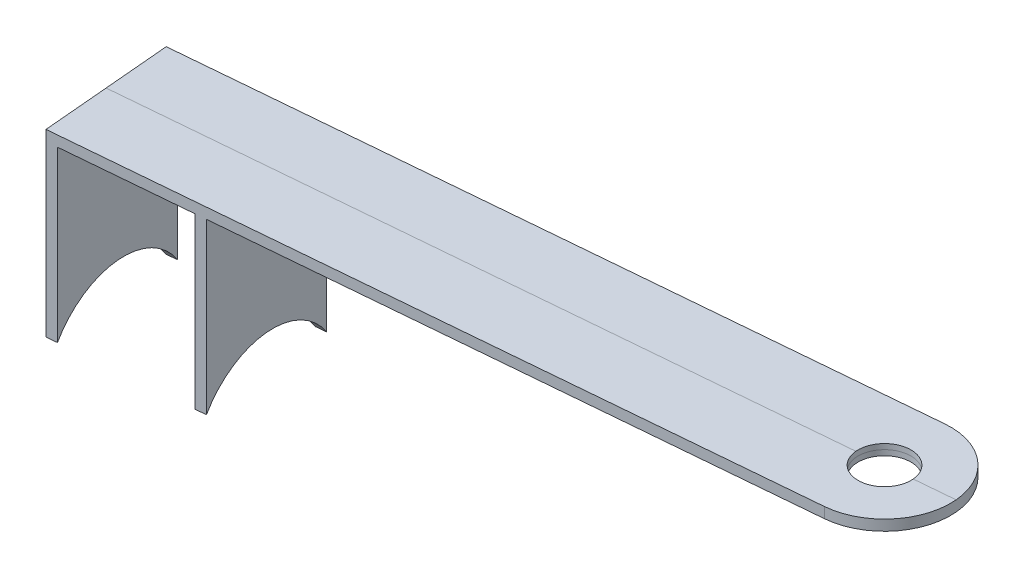
ISO-10303-21;
HEADER;
FILE_DESCRIPTION(('STEP AP214'),'2;1');
FILE_NAME('part.step','',(''),(''),'','','');
FILE_SCHEMA(('AUTOMOTIVE_DESIGN { 1 0 10303 214 1 1 1 1 }'));
ENDSEC;
DATA;
#1=APPLICATION_CONTEXT('core data for automotive mechanical design processes');
#2=APPLICATION_PROTOCOL_DEFINITION('international standard','automotive_design',2000,#1);
#3=PRODUCT_CONTEXT('',#1,'mechanical');
#4=PRODUCT('Part','Part','',(#3));
#5=PRODUCT_RELATED_PRODUCT_CATEGORY('part','',(#4));
#6=PRODUCT_DEFINITION_FORMATION('','',#4);
#7=PRODUCT_DEFINITION_CONTEXT('part definition',#1,'design');
#8=PRODUCT_DEFINITION('design','',#6,#7);
#9=PRODUCT_DEFINITION_SHAPE('','',#8);
#10=(LENGTH_UNIT() NAMED_UNIT(*) SI_UNIT(.MILLI.,.METRE.));
#11=(NAMED_UNIT(*) PLANE_ANGLE_UNIT() SI_UNIT($,.RADIAN.));
#12=(NAMED_UNIT(*) SI_UNIT($,.STERADIAN.) SOLID_ANGLE_UNIT());
#13=UNCERTAINTY_MEASURE_WITH_UNIT(LENGTH_MEASURE(1.E-05),#10,'distance_accuracy_value','');
#14=(GEOMETRIC_REPRESENTATION_CONTEXT(3) GLOBAL_UNCERTAINTY_ASSIGNED_CONTEXT((#13)) GLOBAL_UNIT_ASSIGNED_CONTEXT((#10,
#11,#12)) REPRESENTATION_CONTEXT('',''));
#15=CARTESIAN_POINT('',(0.,0.,0.));
#16=DIRECTION('',(0.,0.,1.));
#17=DIRECTION('',(1.,0.,0.));
#18=AXIS2_PLACEMENT_3D('',#15,#16,#17);
#19=CARTESIAN_POINT('',(95.5283362919159,42.2871579513113,-67.7014814945898));
#20=DIRECTION('',(0.,-1.,0.));
#21=DIRECTION('',(0.,0.,-1.));
#22=AXIS2_PLACEMENT_3D('',#19,#20,#21);
#23=CYLINDRICAL_SURFACE('',#22,5.00000000000001);
#24=CARTESIAN_POINT('',(95.5283362919159,40.2871579513113,-67.7014814945898));
#25=DIRECTION('',(0.,1.,0.));
#26=DIRECTION('',(0.,0.,1.));
#27=AXIS2_PLACEMENT_3D('',#24,#25,#26);
#28=CIRCLE('',#27,5.00000000000001);
#29=CARTESIAN_POINT('',(95.5283362919159,40.2871579513113,-62.7014814945897));
#30=VERTEX_POINT('',#29);
#31=EDGE_CURVE('E169',#30,#30,#28,.T.);
#32=ORIENTED_EDGE('',*,*,#31,.F.);
#33=EDGE_LOOP('',(#32));
#34=FACE_BOUND('',#33,.T.);
#35=CARTESIAN_POINT('',(95.5283362919159,41.2871579513113,-67.7014814945898));
#36=DIRECTION('',(0.,1.,0.));
#37=DIRECTION('',(0.,0.,1.));
#38=AXIS2_PLACEMENT_3D('',#35,#36,#37);
#39=CIRCLE('',#38,5.00000000000001);
#40=CARTESIAN_POINT('',(95.5283362919159,41.2871579513113,-62.7014814945897));
#41=VERTEX_POINT('',#40);
#42=EDGE_CURVE('E12',#41,#41,#39,.T.);
#43=ORIENTED_EDGE('',*,*,#42,.T.);
#44=EDGE_LOOP('',(#43));
#45=FACE_BOUND('',#44,.T.);
#46=ADVANCED_FACE('F48',(#34,#45),#23,.F.);
#47=CARTESIAN_POINT('',(95.5283362919159,42.2871579513113,-67.7014814945898));
#48=DIRECTION('',(0.,1.,0.));
#49=DIRECTION('',(0.,0.,1.));
#50=AXIS2_PLACEMENT_3D('',#47,#48,#49);
#51=PLANE('',#50);
#52=CARTESIAN_POINT('',(95.5283362919159,42.2871579513113,-67.7014814945898));
#53=DIRECTION('',(0.,1.,0.));
#54=DIRECTION('',(0.,0.,1.));
#55=AXIS2_PLACEMENT_3D('',#52,#53,#54);
#56=CIRCLE('',#55,12.5);
#57=CARTESIAN_POINT('',(96.6177830762615,42.2871579513113,-55.2490477684429));
#58=VERTEX_POINT('',#57);
#59=CARTESIAN_POINT('',(107.980770018063,42.2871579513113,-68.7909282789354));
#60=VERTEX_POINT('',#59);
#61=EDGE_CURVE('E174',#58,#60,#56,.T.);
#62=ORIENTED_EDGE('',*,*,#61,.T.);
#63=DIRECTION('',(-0.996194698091746,0.,0.0871557427476519));
#64=VECTOR('',#63,1.);
#65=CARTESIAN_POINT('',(95.5283362919159,42.2871579513113,-67.7014814945897));
#66=LINE('',#65,#64);
#67=CARTESIAN_POINT('',(100.509309782375,42.2871579513113,-68.137260208328));
#68=VERTEX_POINT('',#67);
#69=EDGE_CURVE('E58',#60,#68,#66,.T.);
#70=ORIENTED_EDGE('',*,*,#69,.T.);
#71=CARTESIAN_POINT('',(95.5283362919159,42.2871579513113,-67.7014814945898));
#72=DIRECTION('',(0.,1.,0.));
#73=DIRECTION('',(0.,0.,1.));
#74=AXIS2_PLACEMENT_3D('',#71,#72,#73);
#75=CIRCLE('',#74,5.00000000000001);
#76=CARTESIAN_POINT('',(90.5473628014572,42.2871579513113,-67.2657027808515));
#77=VERTEX_POINT('',#76);
#78=EDGE_CURVE('E269',#77,#68,#75,.T.);
#79=ORIENTED_EDGE('',*,*,#78,.F.);
#80=CARTESIAN_POINT('',(-39.7908169974657,42.2871579513113,-55.862589623843));
#81=VERTEX_POINT('',#80);
#82=EDGE_CURVE('E65',#77,#81,#66,.T.);
#83=ORIENTED_EDGE('',*,*,#82,.T.);
#84=DIRECTION('',(0.0871557427476516,0.,0.996194698091746));
#85=VECTOR('',#84,1.);
#86=CARTESIAN_POINT('',(-40.8802637818113,42.2871579513113,-68.3150233499898));
#87=LINE('',#86,#85);
#88=CARTESIAN_POINT('',(-38.70137021312,42.2871579513113,-43.4101558976961));
#89=VERTEX_POINT('',#88);
#90=EDGE_CURVE('E157',#81,#89,#87,.T.);
#91=ORIENTED_EDGE('',*,*,#90,.T.);
#92=DIRECTION('',(0.996194698091746,0.,-0.0871557427476518));
#93=VECTOR('',#92,1.);
#94=CARTESIAN_POINT('',(-38.70137021312,42.2871579513113,-43.4101558976961));
#95=LINE('',#94,#93);
#96=EDGE_CURVE('E158',#89,#58,#95,.T.);
#97=ORIENTED_EDGE('',*,*,#96,.T.);
#98=EDGE_LOOP('',(#62,#70,#79,#83,#91,#97));
#99=FACE_BOUND('',#98,.T.);
#100=ADVANCED_FACE('F250',(#99),#51,.T.);
#101=CARTESIAN_POINT('',(-37.7984276012822,0.,-56.0369011093383));
#102=DIRECTION('',(-0.996194698091746,0.,0.0871557427476517));
#103=DIRECTION('',(0.0871557427476517,0.,0.996194698091746));
#104=AXIS2_PLACEMENT_3D('',#101,#102,#103);
#105=CYLINDRICAL_SURFACE('',#104,15.);
#106=CARTESIAN_POINT('',(-39.7908169974657,0.,-55.862589623843));
#107=DIRECTION('',(0.996194698091746,0.,-0.0871557427476517));
#108=DIRECTION('',(-0.0871557427476517,0.,-0.996194698091746));
#109=AXIS2_PLACEMENT_3D('',#106,#107,#108);
#110=CIRCLE('',#109,15.);
#111=CARTESIAN_POINT('',(-40.8802637818113,8.2915619758885,-68.3150233499898));
#112=VERTEX_POINT('',#111);
#113=CARTESIAN_POINT('',(-38.70137021312,8.2915619758885,-43.4101558976961));
#114=VERTEX_POINT('',#113);
#115=EDGE_CURVE('E219',#112,#114,#110,.T.);
#116=ORIENTED_EDGE('',*,*,#115,.F.);
#117=DIRECTION('',(-0.996194698091746,0.,0.0871557427476517));
#118=VECTOR('',#117,1.);
#119=CARTESIAN_POINT('',(-38.8878743856278,8.2915619758885,-68.4893348354851));
#120=LINE('',#119,#118);
#121=CARTESIAN_POINT('',(-38.8878743856278,8.2915619758885,-68.4893348354851));
#122=VERTEX_POINT('',#121);
#123=EDGE_CURVE('E146',#122,#112,#120,.T.);
#124=ORIENTED_EDGE('',*,*,#123,.F.);
#125=CARTESIAN_POINT('',(-37.7984276012822,0.,-56.0369011093383));
#126=DIRECTION('',(0.996194698091746,0.,-0.0871557427476517));
#127=DIRECTION('',(-0.0871557427476517,0.,-0.996194698091746));
#128=AXIS2_PLACEMENT_3D('',#125,#126,#127);
#129=CIRCLE('',#128,15.);
#130=CARTESIAN_POINT('',(-36.7089808169365,8.2915619758885,-43.5844673831914));
#131=VERTEX_POINT('',#130);
#132=EDGE_CURVE('E150',#122,#131,#129,.T.);
#133=ORIENTED_EDGE('',*,*,#132,.T.);
#134=DIRECTION('',(-0.996194698091746,0.,0.0871557427476517));
#135=VECTOR('',#134,1.);
#136=CARTESIAN_POINT('',(-36.7089808169365,8.2915619758885,-43.5844673831914));
#137=LINE('',#136,#135);
#138=EDGE_CURVE('E256',#131,#114,#137,.T.);
#139=ORIENTED_EDGE('',*,*,#138,.T.);
#140=EDGE_LOOP('',(#116,#124,#133,#139));
#141=FACE_BOUND('',#140,.T.);
#142=ADVANCED_FACE('F50',(#141),#105,.F.);
#143=CARTESIAN_POINT('',(-38.8878743856278,8.2915619758885,-68.4893348354851));
#144=DIRECTION('',(-0.0871557427476517,0.,-0.996194698091746));
#145=DIRECTION('',(-0.996194698091746,0.,0.0871557427476517));
#146=AXIS2_PLACEMENT_3D('',#143,#144,#145);
#147=PLANE('',#146);
#148=DIRECTION('',(0.,-1.,0.));
#149=VECTOR('',#148,1.);
#150=CARTESIAN_POINT('',(-40.8802637818113,8.2915619758885,-68.3150233499898));
#151=LINE('',#150,#149);
#152=CARTESIAN_POINT('',(-40.8802637818113,42.2871579513113,-68.3150233499898));
#153=VERTEX_POINT('',#152);
#154=EDGE_CURVE('E139',#153,#112,#151,.T.);
#155=ORIENTED_EDGE('',*,*,#154,.F.);
#156=DIRECTION('',(-0.996194698091746,0.,0.0871557427476517));
#157=VECTOR('',#156,1.);
#158=CARTESIAN_POINT('',(-40.8802637818113,42.2871579513113,-68.3150233499898));
#159=LINE('',#158,#157);
#160=CARTESIAN_POINT('',(94.4388895075703,42.2871579513113,-80.1539152207366));
#161=VERTEX_POINT('',#160);
#162=EDGE_CURVE('E144',#161,#153,#159,.T.);
#163=ORIENTED_EDGE('',*,*,#162,.F.);
#164=DIRECTION('',(0.,-1.,0.));
#165=VECTOR('',#164,1.);
#166=CARTESIAN_POINT('',(94.4388895075703,42.2871579513113,-80.1539152207366));
#167=LINE('',#166,#165);
#168=CARTESIAN_POINT('',(94.4388895075703,40.2871579513113,-80.1539152207366));
#169=VERTEX_POINT('',#168);
#170=EDGE_CURVE('E176',#161,#169,#167,.T.);
#171=ORIENTED_EDGE('',*,*,#170,.T.);
#172=DIRECTION('',(-0.996194698091746,0.,0.0871557427476517));
#173=VECTOR('',#172,1.);
#174=CARTESIAN_POINT('',(-40.8802637818113,40.2871579513113,-68.3150233499898));
#175=LINE('',#174,#173);
#176=CARTESIAN_POINT('',(-12.9868122352424,40.2871579513113,-70.755384146924));
#177=VERTEX_POINT('',#176);
#178=EDGE_CURVE('E177',#169,#177,#175,.T.);
#179=ORIENTED_EDGE('',*,*,#178,.T.);
#180=DIRECTION('',(0.,-1.,0.));
#181=VECTOR('',#180,1.);
#182=CARTESIAN_POINT('',(-12.9868122352424,8.2915619758885,-70.755384146924));
#183=LINE('',#182,#181);
#184=CARTESIAN_POINT('',(-12.9868122352424,8.2915619758885,-70.755384146924));
#185=VERTEX_POINT('',#184);
#186=EDGE_CURVE('E192',#177,#185,#183,.T.);
#187=ORIENTED_EDGE('',*,*,#186,.T.);
#188=DIRECTION('',(0.996194698091746,0.,-0.0871557427476517));
#189=VECTOR('',#188,1.);
#190=CARTESIAN_POINT('',(-14.9792016314259,8.2915619758885,-70.5810726614287));
#191=LINE('',#190,#189);
#192=CARTESIAN_POINT('',(-14.9792016314259,8.2915619758885,-70.5810726614287));
#193=VERTEX_POINT('',#192);
#194=EDGE_CURVE('E216',#193,#185,#191,.T.);
#195=ORIENTED_EDGE('',*,*,#194,.F.);
#196=DIRECTION('',(0.,-1.,0.));
#197=VECTOR('',#196,1.);
#198=CARTESIAN_POINT('',(-14.9792016314259,8.2915619758885,-70.5810726614287));
#199=LINE('',#198,#197);
#200=CARTESIAN_POINT('',(-14.9792016314259,40.2871579513113,-70.5810726614287));
#201=VERTEX_POINT('',#200);
#202=EDGE_CURVE('E199',#201,#193,#199,.T.);
#203=ORIENTED_EDGE('',*,*,#202,.F.);
#204=CARTESIAN_POINT('',(-38.8878743856278,40.2871579513113,-68.4893348354851));
#205=VERTEX_POINT('',#204);
#206=EDGE_CURVE('E181',#201,#205,#175,.T.);
#207=ORIENTED_EDGE('',*,*,#206,.T.);
#208=DIRECTION('',(0.,-1.,0.));
#209=VECTOR('',#208,1.);
#210=CARTESIAN_POINT('',(-38.8878743856278,8.2915619758885,-68.4893348354851));
#211=LINE('',#210,#209);
#212=EDGE_CURVE('E257',#205,#122,#211,.T.);
#213=ORIENTED_EDGE('',*,*,#212,.T.);
#214=ORIENTED_EDGE('',*,*,#123,.T.);
#215=EDGE_LOOP('',(#155,#163,#171,#179,#187,#195,#203,#207,#213,#214));
#216=FACE_BOUND('',#215,.T.);
#217=ADVANCED_FACE('F141',(#216),#147,.T.);
#218=CARTESIAN_POINT('',(-36.7089808169365,40.2871579513113,-43.5844673831914));
#219=DIRECTION('',(0.0871557427476517,0.,0.996194698091746));
#220=DIRECTION('',(0.996194698091746,0.,-0.0871557427476517));
#221=AXIS2_PLACEMENT_3D('',#218,#219,#220);
#222=PLANE('',#221);
#223=DIRECTION('',(0.,1.,0.));
#224=VECTOR('',#223,1.);
#225=CARTESIAN_POINT('',(-38.70137021312,40.2871579513113,-43.4101558976961));
#226=LINE('',#225,#224);
#227=EDGE_CURVE('E151',#114,#89,#226,.T.);
#228=ORIENTED_EDGE('',*,*,#227,.F.);
#229=ORIENTED_EDGE('',*,*,#138,.F.);
#230=DIRECTION('',(0.,1.,0.));
#231=VECTOR('',#230,1.);
#232=CARTESIAN_POINT('',(-36.7089808169365,40.2871579513113,-43.5844673831914));
#233=LINE('',#232,#231);
#234=CARTESIAN_POINT('',(-36.7089808169365,40.2871579513113,-43.5844673831914));
#235=VERTEX_POINT('',#234);
#236=EDGE_CURVE('E226',#131,#235,#233,.T.);
#237=ORIENTED_EDGE('',*,*,#236,.T.);
#238=DIRECTION('',(0.996194698091746,0.,-0.0871557427476518));
#239=VECTOR('',#238,1.);
#240=CARTESIAN_POINT('',(-38.70137021312,40.2871579513113,-43.4101558976961));
#241=LINE('',#240,#239);
#242=CARTESIAN_POINT('',(-12.8003080627346,40.2871579513113,-45.6762052091351));
#243=VERTEX_POINT('',#242);
#244=EDGE_CURVE('E166',#235,#243,#241,.T.);
#245=ORIENTED_EDGE('',*,*,#244,.T.);
#246=DIRECTION('',(0.,1.,0.));
#247=VECTOR('',#246,1.);
#248=CARTESIAN_POINT('',(-12.8003080627346,40.2871579513113,-45.6762052091351));
#249=LINE('',#248,#247);
#250=CARTESIAN_POINT('',(-12.8003080627346,8.2915619758885,-45.6762052091351));
#251=VERTEX_POINT('',#250);
#252=EDGE_CURVE('E191',#251,#243,#249,.T.);
#253=ORIENTED_EDGE('',*,*,#252,.F.);
#254=DIRECTION('',(0.996194698091746,0.,-0.0871557427476517));
#255=VECTOR('',#254,1.);
#256=CARTESIAN_POINT('',(-12.8003080627346,8.2915619758885,-45.6762052091351));
#257=LINE('',#256,#255);
#258=CARTESIAN_POINT('',(-10.8079186665511,8.2915619758885,-45.8505166946304));
#259=VERTEX_POINT('',#258);
#260=EDGE_CURVE('E220',#251,#259,#257,.T.);
#261=ORIENTED_EDGE('',*,*,#260,.T.);
#262=DIRECTION('',(0.,1.,0.));
#263=VECTOR('',#262,1.);
#264=CARTESIAN_POINT('',(-10.8079186665511,40.2871579513113,-45.8505166946304));
#265=LINE('',#264,#263);
#266=CARTESIAN_POINT('',(-10.8079186665511,40.2871579513113,-45.8505166946304));
#267=VERTEX_POINT('',#266);
#268=EDGE_CURVE('E214',#259,#267,#265,.T.);
#269=ORIENTED_EDGE('',*,*,#268,.T.);
#270=CARTESIAN_POINT('',(96.6177830762615,40.2871579513113,-55.2490477684429));
#271=VERTEX_POINT('',#270);
#272=EDGE_CURVE('E180',#267,#271,#241,.T.);
#273=ORIENTED_EDGE('',*,*,#272,.T.);
#274=DIRECTION('',(0.,-1.,0.));
#275=VECTOR('',#274,1.);
#276=CARTESIAN_POINT('',(96.6177830762615,42.2871579513113,-55.2490477684429));
#277=LINE('',#276,#275);
#278=EDGE_CURVE('E184',#58,#271,#277,.T.);
#279=ORIENTED_EDGE('',*,*,#278,.F.);
#280=ORIENTED_EDGE('',*,*,#96,.F.);
#281=EDGE_LOOP('',(#228,#229,#237,#245,#253,#261,#269,#273,#279,#280));
#282=FACE_BOUND('',#281,.T.);
#283=ADVANCED_FACE('F236',(#282),#222,.T.);
#284=CARTESIAN_POINT('',(-37.7984276012822,0.,-56.0369011093383));
#285=DIRECTION('',(0.996194698091746,0.,-0.0871557427476517));
#286=DIRECTION('',(-0.0871557427476517,0.,-0.996194698091746));
#287=AXIS2_PLACEMENT_3D('',#284,#285,#286);
#288=PLANE('',#287);
#289=ORIENTED_EDGE('',*,*,#132,.F.);
#290=ORIENTED_EDGE('',*,*,#212,.F.);
#291=DIRECTION('',(-0.0871557427476516,0.,-0.996194698091746));
#292=VECTOR('',#291,1.);
#293=CARTESIAN_POINT('',(-38.8878743856278,40.2871579513113,-68.4893348354851));
#294=LINE('',#293,#292);
#295=EDGE_CURVE('E418',#235,#205,#294,.T.);
#296=ORIENTED_EDGE('',*,*,#295,.F.);
#297=ORIENTED_EDGE('',*,*,#236,.F.);
#298=EDGE_LOOP('',(#289,#290,#296,#297));
#299=FACE_BOUND('',#298,.T.);
#300=ADVANCED_FACE('F304',(#299),#288,.T.);
#301=CARTESIAN_POINT('',(-39.7908169974657,0.,-55.862589623843));
#302=DIRECTION('',(0.996194698091746,0.,-0.0871557427476517));
#303=DIRECTION('',(-0.0871557427476517,0.,-0.996194698091746));
#304=AXIS2_PLACEMENT_3D('',#301,#302,#303);
#305=PLANE('',#304);
#306=ORIENTED_EDGE('',*,*,#115,.T.);
#307=ORIENTED_EDGE('',*,*,#227,.T.);
#308=ORIENTED_EDGE('',*,*,#90,.F.);
#309=EDGE_CURVE('E154',#153,#81,#87,.T.);
#310=ORIENTED_EDGE('',*,*,#309,.F.);
#311=ORIENTED_EDGE('',*,*,#154,.T.);
#312=EDGE_LOOP('',(#306,#307,#308,#310,#311));
#313=FACE_BOUND('',#312,.T.);
#314=ADVANCED_FACE('F155',(#313),#305,.F.);
#315=CARTESIAN_POINT('',(95.5283362919159,40.2871579513113,-67.7014814945898));
#316=DIRECTION('',(0.,1.,0.));
#317=DIRECTION('',(0.,0.,1.));
#318=AXIS2_PLACEMENT_3D('',#315,#316,#317);
#319=PLANE('',#318);
#320=ORIENTED_EDGE('',*,*,#244,.F.);
#321=ORIENTED_EDGE('',*,*,#295,.T.);
#322=ORIENTED_EDGE('',*,*,#206,.F.);
#323=DIRECTION('',(-0.0871557427476519,0.,-0.996194698091746));
#324=VECTOR('',#323,1.);
#325=CARTESIAN_POINT('',(-14.9792016314259,40.2871579513113,-70.5810726614287));
#326=LINE('',#325,#324);
#327=EDGE_CURVE('E195',#243,#201,#326,.T.);
#328=ORIENTED_EDGE('',*,*,#327,.F.);
#329=EDGE_LOOP('',(#320,#321,#322,#328));
#330=FACE_BOUND('',#329,.T.);
#331=ADVANCED_FACE('F291',(#330),#319,.F.);
#332=CARTESIAN_POINT('',(-13.8897548470803,0.,-58.1286389352819));
#333=DIRECTION('',(0.996194698091746,0.,-0.0871557427476517));
#334=DIRECTION('',(0.0871557427476518,0.,0.996194698091746));
#335=AXIS2_PLACEMENT_3D('',#332,#333,#334);
#336=CYLINDRICAL_SURFACE('',#335,15.);
#337=CARTESIAN_POINT('',(-11.8973654508968,0.,-58.3029504207772));
#338=DIRECTION('',(0.996194698091746,0.,-0.0871557427476517));
#339=DIRECTION('',(-0.0871557427476518,0.,-0.996194698091746));
#340=AXIS2_PLACEMENT_3D('',#337,#338,#339);
#341=CIRCLE('',#340,15.);
#342=EDGE_CURVE('E186',#185,#259,#341,.T.);
#343=ORIENTED_EDGE('',*,*,#342,.T.);
#344=ORIENTED_EDGE('',*,*,#260,.F.);
#345=CARTESIAN_POINT('',(-13.8897548470803,0.,-58.1286389352819));
#346=DIRECTION('',(0.996194698091746,0.,-0.0871557427476517));
#347=DIRECTION('',(-0.0871557427476518,0.,-0.996194698091746));
#348=AXIS2_PLACEMENT_3D('',#345,#346,#347);
#349=CIRCLE('',#348,15.);
#350=EDGE_CURVE('E187',#193,#251,#349,.T.);
#351=ORIENTED_EDGE('',*,*,#350,.F.);
#352=ORIENTED_EDGE('',*,*,#194,.T.);
#353=EDGE_LOOP('',(#343,#344,#351,#352));
#354=FACE_BOUND('',#353,.T.);
#355=ADVANCED_FACE('F293',(#354),#336,.F.);
#356=CARTESIAN_POINT('',(-13.8897548470803,0.,-58.1286389352819));
#357=DIRECTION('',(-0.996194698091746,0.,0.0871557427476517));
#358=DIRECTION('',(-0.0871557427476518,0.,-0.996194698091746));
#359=AXIS2_PLACEMENT_3D('',#356,#357,#358);
#360=PLANE('',#359);
#361=ORIENTED_EDGE('',*,*,#350,.T.);
#362=ORIENTED_EDGE('',*,*,#252,.T.);
#363=ORIENTED_EDGE('',*,*,#327,.T.);
#364=ORIENTED_EDGE('',*,*,#202,.T.);
#365=EDGE_LOOP('',(#361,#362,#363,#364));
#366=FACE_BOUND('',#365,.T.);
#367=ADVANCED_FACE('F296',(#366),#360,.T.);
#368=CARTESIAN_POINT('',(-11.8973654508968,0.,-58.3029504207772));
#369=DIRECTION('',(-0.996194698091746,0.,0.0871557427476517));
#370=DIRECTION('',(-0.0871557427476518,0.,-0.996194698091746));
#371=AXIS2_PLACEMENT_3D('',#368,#369,#370);
#372=PLANE('',#371);
#373=ORIENTED_EDGE('',*,*,#342,.F.);
#374=ORIENTED_EDGE('',*,*,#186,.F.);
#375=DIRECTION('',(-0.0871557427476519,0.,-0.996194698091746));
#376=VECTOR('',#375,1.);
#377=CARTESIAN_POINT('',(-12.9868122352424,40.2871579513113,-70.755384146924));
#378=LINE('',#377,#376);
#379=EDGE_CURVE('E210',#267,#177,#378,.T.);
#380=ORIENTED_EDGE('',*,*,#379,.F.);
#381=ORIENTED_EDGE('',*,*,#268,.F.);
#382=EDGE_LOOP('',(#373,#374,#380,#381));
#383=FACE_BOUND('',#382,.T.);
#384=ADVANCED_FACE('F240',(#383),#372,.F.);
#385=ORIENTED_EDGE('',*,*,#31,.T.);
#386=EDGE_LOOP('',(#385));
#387=FACE_BOUND('',#386,.T.);
#388=ORIENTED_EDGE('',*,*,#272,.F.);
#389=ORIENTED_EDGE('',*,*,#379,.T.);
#390=ORIENTED_EDGE('',*,*,#178,.F.);
#391=CARTESIAN_POINT('',(95.5283362919159,40.2871579513113,-67.7014814945898));
#392=DIRECTION('',(0.,1.,0.));
#393=DIRECTION('',(0.,0.,1.));
#394=AXIS2_PLACEMENT_3D('',#391,#392,#393);
#395=CIRCLE('',#394,12.5);
#396=EDGE_CURVE('E164',#271,#169,#395,.T.);
#397=ORIENTED_EDGE('',*,*,#396,.F.);
#398=EDGE_LOOP('',(#388,#389,#390,#397));
#399=FACE_BOUND('',#398,.T.);
#400=ADVANCED_FACE('F243',(#387,#399),#319,.F.);
#401=ORIENTED_EDGE('',*,*,#69,.F.);
#402=EDGE_CURVE('E162',#60,#161,#56,.T.);
#403=ORIENTED_EDGE('',*,*,#402,.T.);
#404=ORIENTED_EDGE('',*,*,#162,.T.);
#405=ORIENTED_EDGE('',*,*,#309,.T.);
#406=ORIENTED_EDGE('',*,*,#82,.F.);
#407=EDGE_CURVE('E266',#68,#77,#75,.T.);
#408=ORIENTED_EDGE('',*,*,#407,.F.);
#409=EDGE_LOOP('',(#401,#403,#404,#405,#406,#408));
#410=FACE_BOUND('',#409,.T.);
#411=ADVANCED_FACE('F160',(#410),#51,.T.);
#412=CARTESIAN_POINT('',(95.5283362919159,42.2871579513113,-67.7014814945898));
#413=DIRECTION('',(0.,-1.,0.));
#414=DIRECTION('',(0.,0.,-1.));
#415=AXIS2_PLACEMENT_3D('',#412,#413,#414);
#416=CYLINDRICAL_SURFACE('',#415,12.5);
#417=ORIENTED_EDGE('',*,*,#396,.T.);
#418=ORIENTED_EDGE('',*,*,#170,.F.);
#419=ORIENTED_EDGE('',*,*,#402,.F.);
#420=ORIENTED_EDGE('',*,*,#61,.F.);
#421=ORIENTED_EDGE('',*,*,#278,.T.);
#422=EDGE_LOOP('',(#417,#418,#419,#420,#421));
#423=FACE_BOUND('',#422,.T.);
#424=ADVANCED_FACE('F247',(#423),#416,.T.);
#425=ORIENTED_EDGE('',*,*,#42,.F.);
#426=EDGE_LOOP('',(#425));
#427=FACE_BOUND('',#426,.T.);
#428=ORIENTED_EDGE('',*,*,#407,.T.);
#429=ORIENTED_EDGE('',*,*,#78,.T.);
#430=EDGE_LOOP('',(#428,#429));
#431=FACE_BOUND('',#430,.T.);
#432=ADVANCED_FACE('F280',(#427,#431),#23,.F.);
#433=CLOSED_SHELL('',(#46,#100,#142,#217,#283,#300,#314,#331,#355,#367,#384,#400,#411,#424,#432));
#434=MANIFOLD_SOLID_BREP('B2',#433);
#435=ADVANCED_BREP_SHAPE_REPRESENTATION('',(#18,#434),#14);
#436=SHAPE_DEFINITION_REPRESENTATION(#9,#435);
ENDSEC;
END-ISO-10303-21;
